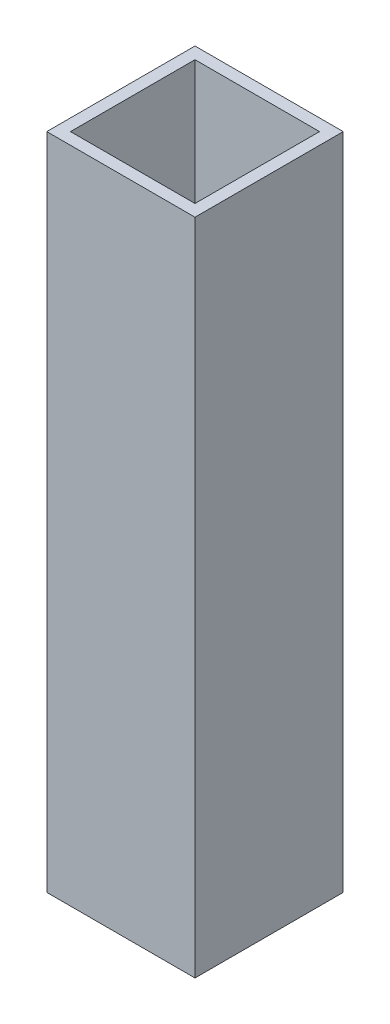
ISO-10303-21;
HEADER;
FILE_DESCRIPTION(('STEP AP214'),'2;1');
FILE_NAME('part.step','',(''),(''),'','','');
FILE_SCHEMA(('AUTOMOTIVE_DESIGN { 1 0 10303 214 1 1 1 1 }'));
ENDSEC;
DATA;
#1=APPLICATION_CONTEXT('core data for automotive mechanical design processes');
#2=APPLICATION_PROTOCOL_DEFINITION('international standard','automotive_design',2000,#1);
#3=PRODUCT_CONTEXT('',#1,'mechanical');
#4=PRODUCT('Part','Part','',(#3));
#5=PRODUCT_RELATED_PRODUCT_CATEGORY('part','',(#4));
#6=PRODUCT_DEFINITION_FORMATION('','',#4);
#7=PRODUCT_DEFINITION_CONTEXT('part definition',#1,'design');
#8=PRODUCT_DEFINITION('design','',#6,#7);
#9=PRODUCT_DEFINITION_SHAPE('','',#8);
#10=(LENGTH_UNIT() NAMED_UNIT(*) SI_UNIT(.MILLI.,.METRE.));
#11=(NAMED_UNIT(*) PLANE_ANGLE_UNIT() SI_UNIT($,.RADIAN.));
#12=(NAMED_UNIT(*) SI_UNIT($,.STERADIAN.) SOLID_ANGLE_UNIT());
#13=UNCERTAINTY_MEASURE_WITH_UNIT(LENGTH_MEASURE(1.E-05),#10,'distance_accuracy_value','');
#14=(GEOMETRIC_REPRESENTATION_CONTEXT(3) GLOBAL_UNCERTAINTY_ASSIGNED_CONTEXT((#13)) GLOBAL_UNIT_ASSIGNED_CONTEXT((#10,
#11,#12)) REPRESENTATION_CONTEXT('',''));
#15=CARTESIAN_POINT('',(0.,0.,0.));
#16=DIRECTION('',(0.,0.,1.));
#17=DIRECTION('',(1.,0.,0.));
#18=AXIS2_PLACEMENT_3D('',#15,#16,#17);
#19=CARTESIAN_POINT('',(22.5,-200.,22.5));
#20=DIRECTION('',(1.,0.,0.));
#21=DIRECTION('',(0.,0.,-1.));
#22=AXIS2_PLACEMENT_3D('',#19,#20,#21);
#23=PLANE('',#22);
#24=DIRECTION('',(0.,0.,-1.));
#25=VECTOR('',#24,1.);
#26=CARTESIAN_POINT('',(22.5,0.,22.5));
#27=LINE('',#26,#25);
#28=CARTESIAN_POINT('',(22.5,0.,22.5));
#29=VERTEX_POINT('',#28);
#30=CARTESIAN_POINT('',(22.5,0.,-22.5));
#31=VERTEX_POINT('',#30);
#32=EDGE_CURVE('E156',#29,#31,#27,.T.);
#33=ORIENTED_EDGE('',*,*,#32,.F.);
#34=DIRECTION('',(0.,1.,0.));
#35=VECTOR('',#34,1.);
#36=CARTESIAN_POINT('',(22.5,-200.,22.5));
#37=LINE('',#36,#35);
#38=CARTESIAN_POINT('',(22.5,-200.,22.5));
#39=VERTEX_POINT('',#38);
#40=EDGE_CURVE('E11',#39,#29,#37,.T.);
#41=ORIENTED_EDGE('',*,*,#40,.F.);
#42=DIRECTION('',(0.,0.,-1.));
#43=VECTOR('',#42,1.);
#44=CARTESIAN_POINT('',(22.5,-200.,22.5));
#45=LINE('',#44,#43);
#46=CARTESIAN_POINT('',(22.5,-200.,-22.5));
#47=VERTEX_POINT('',#46);
#48=EDGE_CURVE('E162',#39,#47,#45,.T.);
#49=ORIENTED_EDGE('',*,*,#48,.T.);
#50=DIRECTION('',(0.,1.,0.));
#51=VECTOR('',#50,1.);
#52=CARTESIAN_POINT('',(22.5,-200.,-22.5));
#53=LINE('',#52,#51);
#54=EDGE_CURVE('E50',#47,#31,#53,.T.);
#55=ORIENTED_EDGE('',*,*,#54,.T.);
#56=EDGE_LOOP('',(#33,#41,#49,#55));
#57=FACE_BOUND('',#56,.T.);
#58=ADVANCED_FACE('F47',(#57),#23,.T.);
#59=CARTESIAN_POINT('',(-22.5,-200.,22.5));
#60=DIRECTION('',(0.,0.,1.));
#61=DIRECTION('',(1.,0.,0.));
#62=AXIS2_PLACEMENT_3D('',#59,#60,#61);
#63=PLANE('',#62);
#64=DIRECTION('',(1.,0.,0.));
#65=VECTOR('',#64,1.);
#66=CARTESIAN_POINT('',(-22.5,0.,22.5));
#67=LINE('',#66,#65);
#68=CARTESIAN_POINT('',(-22.5,0.,22.5));
#69=VERTEX_POINT('',#68);
#70=EDGE_CURVE('E167',#69,#29,#67,.T.);
#71=ORIENTED_EDGE('',*,*,#70,.F.);
#72=DIRECTION('',(0.,1.,0.));
#73=VECTOR('',#72,1.);
#74=CARTESIAN_POINT('',(-22.5,-200.,22.5));
#75=LINE('',#74,#73);
#76=CARTESIAN_POINT('',(-22.5,-200.,22.5));
#77=VERTEX_POINT('',#76);
#78=EDGE_CURVE('E56',#77,#69,#75,.T.);
#79=ORIENTED_EDGE('',*,*,#78,.F.);
#80=DIRECTION('',(1.,0.,0.));
#81=VECTOR('',#80,1.);
#82=CARTESIAN_POINT('',(-22.5,-200.,22.5));
#83=LINE('',#82,#81);
#84=EDGE_CURVE('E175',#77,#39,#83,.T.);
#85=ORIENTED_EDGE('',*,*,#84,.T.);
#86=ORIENTED_EDGE('',*,*,#40,.T.);
#87=EDGE_LOOP('',(#71,#79,#85,#86));
#88=FACE_BOUND('',#87,.T.);
#89=ADVANCED_FACE('F209',(#88),#63,.T.);
#90=CARTESIAN_POINT('',(-22.5,-200.,22.5));
#91=DIRECTION('',(-1.,0.,0.));
#92=DIRECTION('',(0.,0.,1.));
#93=AXIS2_PLACEMENT_3D('',#90,#91,#92);
#94=PLANE('',#93);
#95=DIRECTION('',(0.,0.,1.));
#96=VECTOR('',#95,1.);
#97=CARTESIAN_POINT('',(-22.5,0.,22.5));
#98=LINE('',#97,#96);
#99=CARTESIAN_POINT('',(-22.5,0.,-22.5));
#100=VERTEX_POINT('',#99);
#101=EDGE_CURVE('E186',#100,#69,#98,.T.);
#102=ORIENTED_EDGE('',*,*,#101,.F.);
#103=DIRECTION('',(0.,1.,0.));
#104=VECTOR('',#103,1.);
#105=CARTESIAN_POINT('',(-22.5,-200.,-22.5));
#106=LINE('',#105,#104);
#107=CARTESIAN_POINT('',(-22.5,-200.,-22.5));
#108=VERTEX_POINT('',#107);
#109=EDGE_CURVE('E194',#108,#100,#106,.T.);
#110=ORIENTED_EDGE('',*,*,#109,.F.);
#111=DIRECTION('',(0.,0.,1.));
#112=VECTOR('',#111,1.);
#113=CARTESIAN_POINT('',(-22.5,-200.,22.5));
#114=LINE('',#113,#112);
#115=EDGE_CURVE('E171',#108,#77,#114,.T.);
#116=ORIENTED_EDGE('',*,*,#115,.T.);
#117=ORIENTED_EDGE('',*,*,#78,.T.);
#118=EDGE_LOOP('',(#102,#110,#116,#117));
#119=FACE_BOUND('',#118,.T.);
#120=ADVANCED_FACE('F213',(#119),#94,.T.);
#121=CARTESIAN_POINT('',(-22.5,-200.,-22.5));
#122=DIRECTION('',(0.,0.,-1.));
#123=DIRECTION('',(-1.,0.,0.));
#124=AXIS2_PLACEMENT_3D('',#121,#122,#123);
#125=PLANE('',#124);
#126=DIRECTION('',(-1.,0.,0.));
#127=VECTOR('',#126,1.);
#128=CARTESIAN_POINT('',(-22.5,0.,-22.5));
#129=LINE('',#128,#127);
#130=EDGE_CURVE('E182',#31,#100,#129,.T.);
#131=ORIENTED_EDGE('',*,*,#130,.F.);
#132=ORIENTED_EDGE('',*,*,#54,.F.);
#133=DIRECTION('',(-1.,0.,0.));
#134=VECTOR('',#133,1.);
#135=CARTESIAN_POINT('',(-22.5,-200.,-22.5));
#136=LINE('',#135,#134);
#137=EDGE_CURVE('E166',#47,#108,#136,.T.);
#138=ORIENTED_EDGE('',*,*,#137,.T.);
#139=ORIENTED_EDGE('',*,*,#109,.T.);
#140=EDGE_LOOP('',(#131,#132,#138,#139));
#141=FACE_BOUND('',#140,.T.);
#142=ADVANCED_FACE('F204',(#141),#125,.T.);
#143=CARTESIAN_POINT('',(0.,-200.,0.));
#144=DIRECTION('',(0.,-1.,0.));
#145=DIRECTION('',(0.,0.,-1.));
#146=AXIS2_PLACEMENT_3D('',#143,#144,#145);
#147=PLANE('',#146);
#148=DIRECTION('',(0.,0.,-1.));
#149=VECTOR('',#148,1.);
#150=CARTESIAN_POINT('',(18.9,-200.,18.9));
#151=LINE('',#150,#149);
#152=CARTESIAN_POINT('',(18.9,-200.,18.9));
#153=VERTEX_POINT('',#152);
#154=CARTESIAN_POINT('',(18.9,-200.,-18.9));
#155=VERTEX_POINT('',#154);
#156=EDGE_CURVE('E115',#153,#155,#151,.T.);
#157=ORIENTED_EDGE('',*,*,#156,.T.);
#158=DIRECTION('',(-1.,0.,0.));
#159=VECTOR('',#158,1.);
#160=CARTESIAN_POINT('',(-18.9,-200.,-18.9));
#161=LINE('',#160,#159);
#162=CARTESIAN_POINT('',(-18.9,-200.,-18.9));
#163=VERTEX_POINT('',#162);
#164=EDGE_CURVE('E125',#155,#163,#161,.T.);
#165=ORIENTED_EDGE('',*,*,#164,.T.);
#166=DIRECTION('',(0.,0.,1.));
#167=VECTOR('',#166,1.);
#168=CARTESIAN_POINT('',(-18.9,-200.,18.9));
#169=LINE('',#168,#167);
#170=CARTESIAN_POINT('',(-18.9,-200.,18.9));
#171=VERTEX_POINT('',#170);
#172=EDGE_CURVE('E64',#163,#171,#169,.T.);
#173=ORIENTED_EDGE('',*,*,#172,.T.);
#174=DIRECTION('',(1.,0.,0.));
#175=VECTOR('',#174,1.);
#176=CARTESIAN_POINT('',(-18.9,-200.,18.9));
#177=LINE('',#176,#175);
#178=EDGE_CURVE('E122',#171,#153,#177,.T.);
#179=ORIENTED_EDGE('',*,*,#178,.T.);
#180=EDGE_LOOP('',(#157,#165,#173,#179));
#181=FACE_BOUND('',#180,.T.);
#182=ORIENTED_EDGE('',*,*,#48,.F.);
#183=ORIENTED_EDGE('',*,*,#84,.F.);
#184=ORIENTED_EDGE('',*,*,#115,.F.);
#185=ORIENTED_EDGE('',*,*,#137,.F.);
#186=EDGE_LOOP('',(#182,#183,#184,#185));
#187=FACE_BOUND('',#186,.T.);
#188=ADVANCED_FACE('F130',(#181,#187),#147,.T.);
#189=CARTESIAN_POINT('',(0.,0.,0.));
#190=DIRECTION('',(0.,-1.,0.));
#191=DIRECTION('',(0.,0.,-1.));
#192=AXIS2_PLACEMENT_3D('',#189,#190,#191);
#193=PLANE('',#192);
#194=DIRECTION('',(-1.,0.,0.));
#195=VECTOR('',#194,1.);
#196=CARTESIAN_POINT('',(-18.9,0.,-18.9));
#197=LINE('',#196,#195);
#198=CARTESIAN_POINT('',(18.9,0.,-18.9));
#199=VERTEX_POINT('',#198);
#200=CARTESIAN_POINT('',(-18.9,0.,-18.9));
#201=VERTEX_POINT('',#200);
#202=EDGE_CURVE('E147',#199,#201,#197,.T.);
#203=ORIENTED_EDGE('',*,*,#202,.F.);
#204=DIRECTION('',(0.,0.,-1.));
#205=VECTOR('',#204,1.);
#206=CARTESIAN_POINT('',(18.9,0.,18.9));
#207=LINE('',#206,#205);
#208=CARTESIAN_POINT('',(18.9,0.,18.9));
#209=VERTEX_POINT('',#208);
#210=EDGE_CURVE('E72',#209,#199,#207,.T.);
#211=ORIENTED_EDGE('',*,*,#210,.F.);
#212=DIRECTION('',(1.,0.,0.));
#213=VECTOR('',#212,1.);
#214=CARTESIAN_POINT('',(-18.9,0.,18.9));
#215=LINE('',#214,#213);
#216=CARTESIAN_POINT('',(-18.9,0.,18.9));
#217=VERTEX_POINT('',#216);
#218=EDGE_CURVE('E134',#217,#209,#215,.T.);
#219=ORIENTED_EDGE('',*,*,#218,.F.);
#220=DIRECTION('',(0.,0.,1.));
#221=VECTOR('',#220,1.);
#222=CARTESIAN_POINT('',(-18.9,0.,18.9));
#223=LINE('',#222,#221);
#224=EDGE_CURVE('E138',#201,#217,#223,.T.);
#225=ORIENTED_EDGE('',*,*,#224,.F.);
#226=EDGE_LOOP('',(#203,#211,#219,#225));
#227=FACE_BOUND('',#226,.T.);
#228=ORIENTED_EDGE('',*,*,#32,.T.);
#229=ORIENTED_EDGE('',*,*,#130,.T.);
#230=ORIENTED_EDGE('',*,*,#101,.T.);
#231=ORIENTED_EDGE('',*,*,#70,.T.);
#232=EDGE_LOOP('',(#228,#229,#230,#231));
#233=FACE_BOUND('',#232,.T.);
#234=ADVANCED_FACE('F206',(#227,#233),#193,.F.);
#235=CARTESIAN_POINT('',(18.9,-200.,18.9));
#236=DIRECTION('',(1.,0.,0.));
#237=DIRECTION('',(0.,0.,-1.));
#238=AXIS2_PLACEMENT_3D('',#235,#236,#237);
#239=PLANE('',#238);
#240=ORIENTED_EDGE('',*,*,#210,.T.);
#241=DIRECTION('',(0.,1.,0.));
#242=VECTOR('',#241,1.);
#243=CARTESIAN_POINT('',(18.9,-200.,-18.9));
#244=LINE('',#243,#242);
#245=EDGE_CURVE('E111',#155,#199,#244,.T.);
#246=ORIENTED_EDGE('',*,*,#245,.F.);
#247=ORIENTED_EDGE('',*,*,#156,.F.);
#248=DIRECTION('',(0.,1.,0.));
#249=VECTOR('',#248,1.);
#250=CARTESIAN_POINT('',(18.9,-200.,18.9));
#251=LINE('',#250,#249);
#252=EDGE_CURVE('E153',#153,#209,#251,.T.);
#253=ORIENTED_EDGE('',*,*,#252,.T.);
#254=EDGE_LOOP('',(#240,#246,#247,#253));
#255=FACE_BOUND('',#254,.T.);
#256=ADVANCED_FACE('F113',(#255),#239,.F.);
#257=CARTESIAN_POINT('',(-18.9,-200.,18.9));
#258=DIRECTION('',(0.,0.,1.));
#259=DIRECTION('',(1.,0.,0.));
#260=AXIS2_PLACEMENT_3D('',#257,#258,#259);
#261=PLANE('',#260);
#262=ORIENTED_EDGE('',*,*,#218,.T.);
#263=ORIENTED_EDGE('',*,*,#252,.F.);
#264=ORIENTED_EDGE('',*,*,#178,.F.);
#265=DIRECTION('',(0.,1.,0.));
#266=VECTOR('',#265,1.);
#267=CARTESIAN_POINT('',(-18.9,-200.,18.9));
#268=LINE('',#267,#266);
#269=EDGE_CURVE('E157',#171,#217,#268,.T.);
#270=ORIENTED_EDGE('',*,*,#269,.T.);
#271=EDGE_LOOP('',(#262,#263,#264,#270));
#272=FACE_BOUND('',#271,.T.);
#273=ADVANCED_FACE('F267',(#272),#261,.F.);
#274=CARTESIAN_POINT('',(-18.9,-200.,18.9));
#275=DIRECTION('',(-1.,0.,0.));
#276=DIRECTION('',(0.,0.,1.));
#277=AXIS2_PLACEMENT_3D('',#274,#275,#276);
#278=PLANE('',#277);
#279=ORIENTED_EDGE('',*,*,#224,.T.);
#280=ORIENTED_EDGE('',*,*,#269,.F.);
#281=ORIENTED_EDGE('',*,*,#172,.F.);
#282=DIRECTION('',(0.,1.,0.));
#283=VECTOR('',#282,1.);
#284=CARTESIAN_POINT('',(-18.9,-200.,-18.9));
#285=LINE('',#284,#283);
#286=EDGE_CURVE('E121',#163,#201,#285,.T.);
#287=ORIENTED_EDGE('',*,*,#286,.T.);
#288=EDGE_LOOP('',(#279,#280,#281,#287));
#289=FACE_BOUND('',#288,.T.);
#290=ADVANCED_FACE('F276',(#289),#278,.F.);
#291=CARTESIAN_POINT('',(-18.9,-200.,-18.9));
#292=DIRECTION('',(0.,0.,-1.));
#293=DIRECTION('',(-1.,0.,0.));
#294=AXIS2_PLACEMENT_3D('',#291,#292,#293);
#295=PLANE('',#294);
#296=ORIENTED_EDGE('',*,*,#202,.T.);
#297=ORIENTED_EDGE('',*,*,#286,.F.);
#298=ORIENTED_EDGE('',*,*,#164,.F.);
#299=ORIENTED_EDGE('',*,*,#245,.T.);
#300=EDGE_LOOP('',(#296,#297,#298,#299));
#301=FACE_BOUND('',#300,.T.);
#302=ADVANCED_FACE('F126',(#301),#295,.F.);
#303=CLOSED_SHELL('',(#58,#89,#120,#142,#188,#234,#256,#273,#290,#302));
#304=MANIFOLD_SOLID_BREP('B2',#303);
#305=ADVANCED_BREP_SHAPE_REPRESENTATION('',(#18,#304),#14);
#306=SHAPE_DEFINITION_REPRESENTATION(#9,#305);
ENDSEC;
END-ISO-10303-21;
